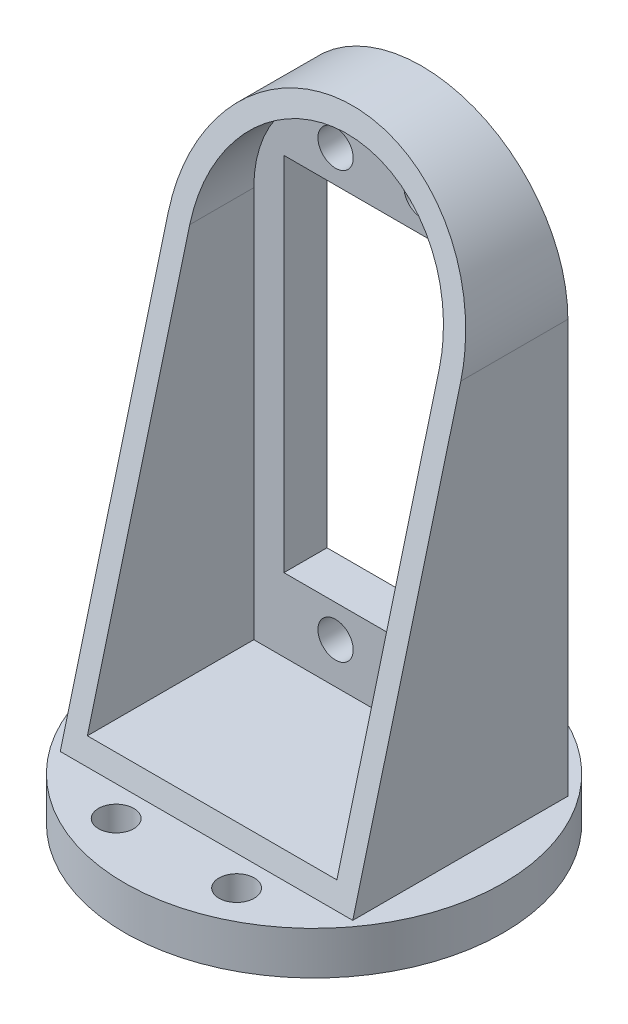
ISO-10303-21;
HEADER;
FILE_DESCRIPTION(('STEP AP214'),'2;1');
FILE_NAME('part.step','',(''),(''),'','','');
FILE_SCHEMA(('AUTOMOTIVE_DESIGN { 1 0 10303 214 1 1 1 1 }'));
ENDSEC;
DATA;
#1=APPLICATION_CONTEXT('core data for automotive mechanical design processes');
#2=APPLICATION_PROTOCOL_DEFINITION('international standard','automotive_design',2000,#1);
#3=PRODUCT_CONTEXT('',#1,'mechanical');
#4=PRODUCT('Part','Part','',(#3));
#5=PRODUCT_RELATED_PRODUCT_CATEGORY('part','',(#4));
#6=PRODUCT_DEFINITION_FORMATION('','',#4);
#7=PRODUCT_DEFINITION_CONTEXT('part definition',#1,'design');
#8=PRODUCT_DEFINITION('design','',#6,#7);
#9=PRODUCT_DEFINITION_SHAPE('','',#8);
#10=(LENGTH_UNIT() NAMED_UNIT(*) SI_UNIT(.MILLI.,.METRE.));
#11=(NAMED_UNIT(*) PLANE_ANGLE_UNIT() SI_UNIT($,.RADIAN.));
#12=(NAMED_UNIT(*) SI_UNIT($,.STERADIAN.) SOLID_ANGLE_UNIT());
#13=UNCERTAINTY_MEASURE_WITH_UNIT(LENGTH_MEASURE(1.E-05),#10,'distance_accuracy_value','');
#14=(GEOMETRIC_REPRESENTATION_CONTEXT(3) GLOBAL_UNCERTAINTY_ASSIGNED_CONTEXT((#13)) GLOBAL_UNIT_ASSIGNED_CONTEXT((#10,
#11,#12)) REPRESENTATION_CONTEXT('',''));
#15=CARTESIAN_POINT('',(0.,0.,0.));
#16=DIRECTION('',(0.,0.,1.));
#17=DIRECTION('',(1.,0.,0.));
#18=AXIS2_PLACEMENT_3D('',#15,#16,#17);
#19=CARTESIAN_POINT('',(17.,0.,5.));
#20=DIRECTION('',(1.,0.,0.));
#21=DIRECTION('',(0.,1.,0.));
#22=AXIS2_PLACEMENT_3D('',#19,#20,#21);
#23=PLANE('',#22);
#24=DIRECTION('',(0.,0.967459022681129,-0.253027744393526));
#25=VECTOR('',#24,1.);
#26=CARTESIAN_POINT('',(17.,-32.,25.));
#27=LINE('',#26,#25);
#28=CARTESIAN_POINT('',(17.,-32.,25.));
#29=VERTEX_POINT('',#28);
#30=CARTESIAN_POINT('',(17.,16.,12.4461538461538));
#31=VERTEX_POINT('',#30);
#32=EDGE_CURVE('E485',#29,#31,#27,.T.);
#33=ORIENTED_EDGE('',*,*,#32,.F.);
#34=DIRECTION('',(0.,0.,-1.));
#35=VECTOR('',#34,1.);
#36=CARTESIAN_POINT('',(17.,-32.,5.));
#37=LINE('',#36,#35);
#38=CARTESIAN_POINT('',(17.,-32.,0.));
#39=VERTEX_POINT('',#38);
#40=EDGE_CURVE('E177',#29,#39,#37,.T.);
#41=ORIENTED_EDGE('',*,*,#40,.T.);
#42=DIRECTION('',(0.,-1.,0.));
#43=VECTOR('',#42,1.);
#44=CARTESIAN_POINT('',(17.,0.,0.));
#45=LINE('',#44,#43);
#46=CARTESIAN_POINT('',(17.,16.,0.));
#47=VERTEX_POINT('',#46);
#48=EDGE_CURVE('E157',#47,#39,#45,.T.);
#49=ORIENTED_EDGE('',*,*,#48,.F.);
#50=DIRECTION('',(0.,0.,-1.));
#51=VECTOR('',#50,1.);
#52=CARTESIAN_POINT('',(17.,16.,5.));
#53=LINE('',#52,#51);
#54=EDGE_CURVE('E68',#31,#47,#53,.T.);
#55=ORIENTED_EDGE('',*,*,#54,.F.);
#56=EDGE_LOOP('',(#33,#41,#49,#55));
#57=FACE_BOUND('',#56,.T.);
#58=ADVANCED_FACE('F61',(#57),#23,.T.);
#59=CARTESIAN_POINT('',(0.,16.,5.));
#60=DIRECTION('',(0.,0.,-1.));
#61=DIRECTION('',(-1.,0.,0.));
#62=AXIS2_PLACEMENT_3D('',#59,#60,#61);
#63=CYLINDRICAL_SURFACE('',#62,17.);
#64=CARTESIAN_POINT('',(0.,16.,12.4461538461538));
#65=DIRECTION('',(0.,-0.253027744393526,-0.967459022681128));
#66=DIRECTION('',(0.,0.967459022681129,-0.253027744393526));
#67=AXIS2_PLACEMENT_3D('',#64,#65,#66);
#68=ELLIPSE('',#67,17.5718036644981,17.);
#69=CARTESIAN_POINT('',(-17.,16.,12.4461538461538));
#70=VERTEX_POINT('',#69);
#71=EDGE_CURVE('E186',#70,#31,#68,.T.);
#72=ORIENTED_EDGE('',*,*,#71,.T.);
#73=ORIENTED_EDGE('',*,*,#54,.T.);
#74=CARTESIAN_POINT('',(0.,16.,0.));
#75=DIRECTION('',(0.,0.,1.));
#76=DIRECTION('',(1.,0.,0.));
#77=AXIS2_PLACEMENT_3D('',#74,#75,#76);
#78=CIRCLE('',#77,17.);
#79=CARTESIAN_POINT('',(-17.,16.,0.));
#80=VERTEX_POINT('',#79);
#81=EDGE_CURVE('E172',#47,#80,#78,.T.);
#82=ORIENTED_EDGE('',*,*,#81,.T.);
#83=DIRECTION('',(0.,0.,-1.));
#84=VECTOR('',#83,1.);
#85=CARTESIAN_POINT('',(-17.,16.,5.));
#86=LINE('',#85,#84);
#87=EDGE_CURVE('E170',#70,#80,#86,.T.);
#88=ORIENTED_EDGE('',*,*,#87,.F.);
#89=EDGE_LOOP('',(#72,#73,#82,#88));
#90=FACE_BOUND('',#89,.T.);
#91=ADVANCED_FACE('F185',(#90),#63,.T.);
#92=CARTESIAN_POINT('',(-17.,0.,5.));
#93=DIRECTION('',(1.,0.,0.));
#94=DIRECTION('',(0.,1.,0.));
#95=AXIS2_PLACEMENT_3D('',#92,#93,#94);
#96=PLANE('',#95);
#97=DIRECTION('',(0.,0.,-1.));
#98=VECTOR('',#97,1.);
#99=CARTESIAN_POINT('',(-17.,-32.,5.));
#100=LINE('',#99,#98);
#101=CARTESIAN_POINT('',(-17.,-32.,25.));
#102=VERTEX_POINT('',#101);
#103=CARTESIAN_POINT('',(-17.,-32.,0.));
#104=VERTEX_POINT('',#103);
#105=EDGE_CURVE('E167',#102,#104,#100,.T.);
#106=ORIENTED_EDGE('',*,*,#105,.F.);
#107=DIRECTION('',(0.,0.967459022681129,-0.253027744393526));
#108=VECTOR('',#107,1.);
#109=CARTESIAN_POINT('',(-17.,-32.,25.));
#110=LINE('',#109,#108);
#111=EDGE_CURVE('E488',#102,#70,#110,.T.);
#112=ORIENTED_EDGE('',*,*,#111,.T.);
#113=ORIENTED_EDGE('',*,*,#87,.T.);
#114=DIRECTION('',(0.,-1.,0.));
#115=VECTOR('',#114,1.);
#116=CARTESIAN_POINT('',(-17.,0.,0.));
#117=LINE('',#116,#115);
#118=EDGE_CURVE('E155',#80,#104,#117,.T.);
#119=ORIENTED_EDGE('',*,*,#118,.T.);
#120=EDGE_LOOP('',(#106,#112,#113,#119));
#121=FACE_BOUND('',#120,.T.);
#122=ADVANCED_FACE('F165',(#121),#96,.F.);
#123=CARTESIAN_POINT('',(5.00000000000051,-24.75,5.));
#124=DIRECTION('',(0.,0.,-1.));
#125=DIRECTION('',(-1.,0.,0.));
#126=AXIS2_PLACEMENT_3D('',#123,#124,#125);
#127=CYLINDRICAL_SURFACE('',#126,2.05);
#128=CARTESIAN_POINT('',(5.00000000000051,-24.75,5.));
#129=DIRECTION('',(0.,0.,1.));
#130=DIRECTION('',(1.,0.,0.));
#131=AXIS2_PLACEMENT_3D('',#128,#129,#130);
#132=CIRCLE('',#131,2.05);
#133=CARTESIAN_POINT('',(7.05000000000051,-24.75,5.));
#134=VERTEX_POINT('',#133);
#135=EDGE_CURVE('E216',#134,#134,#132,.T.);
#136=ORIENTED_EDGE('',*,*,#135,.T.);
#137=EDGE_LOOP('',(#136));
#138=FACE_BOUND('',#137,.T.);
#139=CARTESIAN_POINT('',(5.00000000000051,-24.75,0.));
#140=DIRECTION('',(0.,0.,1.));
#141=DIRECTION('',(1.,0.,0.));
#142=AXIS2_PLACEMENT_3D('',#139,#140,#141);
#143=CIRCLE('',#142,2.05);
#144=CARTESIAN_POINT('',(7.05000000000051,-24.75,0.));
#145=VERTEX_POINT('',#144);
#146=EDGE_CURVE('E203',#145,#145,#143,.T.);
#147=ORIENTED_EDGE('',*,*,#146,.F.);
#148=EDGE_LOOP('',(#147));
#149=FACE_BOUND('',#148,.T.);
#150=ADVANCED_FACE('F252',(#138,#149),#127,.F.);
#151=CARTESIAN_POINT('',(-5.00000000000026,24.75,5.));
#152=DIRECTION('',(0.,0.,-1.));
#153=DIRECTION('',(-1.,0.,0.));
#154=AXIS2_PLACEMENT_3D('',#151,#152,#153);
#155=CYLINDRICAL_SURFACE('',#154,2.05000000000024);
#156=CARTESIAN_POINT('',(-5.00000000000026,24.75,5.));
#157=DIRECTION('',(0.,0.,1.));
#158=DIRECTION('',(1.,0.,0.));
#159=AXIS2_PLACEMENT_3D('',#156,#157,#158);
#160=CIRCLE('',#159,2.05000000000024);
#161=CARTESIAN_POINT('',(-2.95000000000002,24.75,5.));
#162=VERTEX_POINT('',#161);
#163=EDGE_CURVE('E211',#162,#162,#160,.T.);
#164=ORIENTED_EDGE('',*,*,#163,.T.);
#165=EDGE_LOOP('',(#164));
#166=FACE_BOUND('',#165,.T.);
#167=CARTESIAN_POINT('',(-5.00000000000026,24.75,0.));
#168=DIRECTION('',(0.,0.,1.));
#169=DIRECTION('',(1.,0.,0.));
#170=AXIS2_PLACEMENT_3D('',#167,#168,#169);
#171=CIRCLE('',#170,2.05000000000024);
#172=CARTESIAN_POINT('',(-2.95000000000002,24.75,0.));
#173=VERTEX_POINT('',#172);
#174=EDGE_CURVE('E200',#173,#173,#171,.T.);
#175=ORIENTED_EDGE('',*,*,#174,.F.);
#176=EDGE_LOOP('',(#175));
#177=FACE_BOUND('',#176,.T.);
#178=ADVANCED_FACE('F257',(#166,#177),#155,.F.);
#179=CARTESIAN_POINT('',(4.99999999999974,24.75,5.));
#180=DIRECTION('',(0.,0.,-1.));
#181=DIRECTION('',(-1.,0.,0.));
#182=AXIS2_PLACEMENT_3D('',#179,#180,#181);
#183=CYLINDRICAL_SURFACE('',#182,2.05000000000024);
#184=CARTESIAN_POINT('',(4.99999999999974,24.75,5.));
#185=DIRECTION('',(0.,0.,1.));
#186=DIRECTION('',(1.,0.,0.));
#187=AXIS2_PLACEMENT_3D('',#184,#185,#186);
#188=CIRCLE('',#187,2.05000000000024);
#189=CARTESIAN_POINT('',(7.04999999999999,24.75,5.));
#190=VERTEX_POINT('',#189);
#191=EDGE_CURVE('E207',#190,#190,#188,.T.);
#192=ORIENTED_EDGE('',*,*,#191,.T.);
#193=EDGE_LOOP('',(#192));
#194=FACE_BOUND('',#193,.T.);
#195=CARTESIAN_POINT('',(4.99999999999974,24.75,0.));
#196=DIRECTION('',(0.,0.,1.));
#197=DIRECTION('',(1.,0.,0.));
#198=AXIS2_PLACEMENT_3D('',#195,#196,#197);
#199=CIRCLE('',#198,2.05000000000024);
#200=CARTESIAN_POINT('',(7.04999999999999,24.75,0.));
#201=VERTEX_POINT('',#200);
#202=EDGE_CURVE('E161',#201,#201,#199,.T.);
#203=ORIENTED_EDGE('',*,*,#202,.F.);
#204=EDGE_LOOP('',(#203));
#205=FACE_BOUND('',#204,.T.);
#206=ADVANCED_FACE('F241',(#194,#205),#183,.F.);
#207=CARTESIAN_POINT('',(-4.99999999999949,-24.75,5.));
#208=DIRECTION('',(0.,0.,-1.));
#209=DIRECTION('',(-1.,0.,0.));
#210=AXIS2_PLACEMENT_3D('',#207,#208,#209);
#211=CYLINDRICAL_SURFACE('',#210,2.05);
#212=CARTESIAN_POINT('',(-4.99999999999949,-24.75,5.));
#213=DIRECTION('',(0.,0.,1.));
#214=DIRECTION('',(1.,0.,0.));
#215=AXIS2_PLACEMENT_3D('',#212,#213,#214);
#216=CIRCLE('',#215,2.05);
#217=CARTESIAN_POINT('',(-2.94999999999949,-24.75,5.));
#218=VERTEX_POINT('',#217);
#219=EDGE_CURVE('E180',#218,#218,#216,.T.);
#220=ORIENTED_EDGE('',*,*,#219,.T.);
#221=EDGE_LOOP('',(#220));
#222=FACE_BOUND('',#221,.T.);
#223=CARTESIAN_POINT('',(-4.99999999999949,-24.75,0.));
#224=DIRECTION('',(0.,0.,1.));
#225=DIRECTION('',(1.,0.,0.));
#226=AXIS2_PLACEMENT_3D('',#223,#224,#225);
#227=CIRCLE('',#226,2.05);
#228=CARTESIAN_POINT('',(-2.94999999999949,-24.75,0.));
#229=VERTEX_POINT('',#228);
#230=EDGE_CURVE('E205',#229,#229,#227,.T.);
#231=ORIENTED_EDGE('',*,*,#230,.F.);
#232=EDGE_LOOP('',(#231));
#233=FACE_BOUND('',#232,.T.);
#234=ADVANCED_FACE('F227',(#222,#233),#211,.F.);
#235=CARTESIAN_POINT('',(0.,0.,5.));
#236=DIRECTION('',(0.,0.,1.));
#237=DIRECTION('',(1.,0.,0.));
#238=AXIS2_PLACEMENT_3D('',#235,#236,#237);
#239=PLANE('',#238);
#240=CARTESIAN_POINT('',(0.,16.,5.));
#241=DIRECTION('',(0.,0.,1.));
#242=DIRECTION('',(1.,0.,0.));
#243=AXIS2_PLACEMENT_3D('',#240,#241,#242);
#244=CIRCLE('',#243,14.5);
#245=CARTESIAN_POINT('',(14.5,16.,5.));
#246=VERTEX_POINT('',#245);
#247=CARTESIAN_POINT('',(-14.5,16.,5.));
#248=VERTEX_POINT('',#247);
#249=EDGE_CURVE('E497',#246,#248,#244,.T.);
#250=ORIENTED_EDGE('',*,*,#249,.T.);
#251=DIRECTION('',(0.,-1.,0.));
#252=VECTOR('',#251,1.);
#253=CARTESIAN_POINT('',(-14.5,16.,5.));
#254=LINE('',#253,#252);
#255=CARTESIAN_POINT('',(-14.5,-29.5,5.));
#256=VERTEX_POINT('',#255);
#257=EDGE_CURVE('E499',#248,#256,#254,.T.);
#258=ORIENTED_EDGE('',*,*,#257,.T.);
#259=DIRECTION('',(1.,0.,0.));
#260=VECTOR('',#259,1.);
#261=CARTESIAN_POINT('',(-14.5,-29.5,5.));
#262=LINE('',#261,#260);
#263=CARTESIAN_POINT('',(14.5,-29.5,5.));
#264=VERTEX_POINT('',#263);
#265=EDGE_CURVE('E502',#256,#264,#262,.T.);
#266=ORIENTED_EDGE('',*,*,#265,.T.);
#267=DIRECTION('',(0.,1.,0.));
#268=VECTOR('',#267,1.);
#269=CARTESIAN_POINT('',(14.5,-29.5,5.));
#270=LINE('',#269,#268);
#271=EDGE_CURVE('E505',#264,#246,#270,.T.);
#272=ORIENTED_EDGE('',*,*,#271,.T.);
#273=EDGE_LOOP('',(#250,#258,#266,#272));
#274=FACE_BOUND('',#273,.T.);
#275=DIRECTION('',(1.,0.,0.));
#276=VECTOR('',#275,1.);
#277=CARTESIAN_POINT('',(-11.,21.,5.));
#278=LINE('',#277,#276);
#279=CARTESIAN_POINT('',(-11.,21.,5.));
#280=VERTEX_POINT('',#279);
#281=CARTESIAN_POINT('',(11.,21.,5.));
#282=VERTEX_POINT('',#281);
#283=EDGE_CURVE('E517',#280,#282,#278,.T.);
#284=ORIENTED_EDGE('',*,*,#283,.T.);
#285=DIRECTION('',(0.,1.,0.));
#286=VECTOR('',#285,1.);
#287=CARTESIAN_POINT('',(11.,-21.,5.));
#288=LINE('',#287,#286);
#289=CARTESIAN_POINT('',(11.,-21.,5.));
#290=VERTEX_POINT('',#289);
#291=EDGE_CURVE('E520',#290,#282,#288,.T.);
#292=ORIENTED_EDGE('',*,*,#291,.F.);
#293=DIRECTION('',(1.,0.,0.));
#294=VECTOR('',#293,1.);
#295=CARTESIAN_POINT('',(-11.,-21.,5.));
#296=LINE('',#295,#294);
#297=CARTESIAN_POINT('',(-11.,-21.,5.));
#298=VERTEX_POINT('',#297);
#299=EDGE_CURVE('E523',#298,#290,#296,.T.);
#300=ORIENTED_EDGE('',*,*,#299,.F.);
#301=DIRECTION('',(0.,1.,0.));
#302=VECTOR('',#301,1.);
#303=CARTESIAN_POINT('',(-11.,-21.,5.));
#304=LINE('',#303,#302);
#305=EDGE_CURVE('E526',#298,#280,#304,.T.);
#306=ORIENTED_EDGE('',*,*,#305,.T.);
#307=EDGE_LOOP('',(#284,#292,#300,#306));
#308=FACE_BOUND('',#307,.T.);
#309=ORIENTED_EDGE('',*,*,#191,.F.);
#310=EDGE_LOOP('',(#309));
#311=FACE_BOUND('',#310,.T.);
#312=ORIENTED_EDGE('',*,*,#163,.F.);
#313=EDGE_LOOP('',(#312));
#314=FACE_BOUND('',#313,.T.);
#315=ORIENTED_EDGE('',*,*,#135,.F.);
#316=EDGE_LOOP('',(#315));
#317=FACE_BOUND('',#316,.T.);
#318=ORIENTED_EDGE('',*,*,#219,.F.);
#319=EDGE_LOOP('',(#318));
#320=FACE_BOUND('',#319,.T.);
#321=ADVANCED_FACE('F230',(#274,#308,#311,#314,#317,#320),#239,.T.);
#322=CARTESIAN_POINT('',(0.,0.,0.));
#323=DIRECTION('',(0.,0.,1.));
#324=DIRECTION('',(1.,0.,0.));
#325=AXIS2_PLACEMENT_3D('',#322,#323,#324);
#326=PLANE('',#325);
#327=DIRECTION('',(0.,1.,0.));
#328=VECTOR('',#327,1.);
#329=CARTESIAN_POINT('',(11.,-21.,0.));
#330=LINE('',#329,#328);
#331=CARTESIAN_POINT('',(11.,-21.,0.));
#332=VERTEX_POINT('',#331);
#333=CARTESIAN_POINT('',(11.,21.,0.));
#334=VERTEX_POINT('',#333);
#335=EDGE_CURVE('E530',#332,#334,#330,.T.);
#336=ORIENTED_EDGE('',*,*,#335,.T.);
#337=DIRECTION('',(1.,0.,0.));
#338=VECTOR('',#337,1.);
#339=CARTESIAN_POINT('',(-11.,21.,0.));
#340=LINE('',#339,#338);
#341=CARTESIAN_POINT('',(-11.,21.,0.));
#342=VERTEX_POINT('',#341);
#343=EDGE_CURVE('E516',#342,#334,#340,.T.);
#344=ORIENTED_EDGE('',*,*,#343,.F.);
#345=DIRECTION('',(0.,1.,0.));
#346=VECTOR('',#345,1.);
#347=CARTESIAN_POINT('',(-11.,-21.,0.));
#348=LINE('',#347,#346);
#349=CARTESIAN_POINT('',(-11.,-21.,0.));
#350=VERTEX_POINT('',#349);
#351=EDGE_CURVE('E521',#350,#342,#348,.T.);
#352=ORIENTED_EDGE('',*,*,#351,.F.);
#353=DIRECTION('',(1.,0.,0.));
#354=VECTOR('',#353,1.);
#355=CARTESIAN_POINT('',(-11.,-21.,0.));
#356=LINE('',#355,#354);
#357=EDGE_CURVE('E533',#350,#332,#356,.T.);
#358=ORIENTED_EDGE('',*,*,#357,.T.);
#359=EDGE_LOOP('',(#336,#344,#352,#358));
#360=FACE_BOUND('',#359,.T.);
#361=ORIENTED_EDGE('',*,*,#48,.T.);
#362=DIRECTION('',(-1.,0.,0.));
#363=VECTOR('',#362,1.);
#364=CARTESIAN_POINT('',(0.,-32.,0.));
#365=LINE('',#364,#363);
#366=EDGE_CURVE('E150',#39,#104,#365,.T.);
#367=ORIENTED_EDGE('',*,*,#366,.T.);
#368=ORIENTED_EDGE('',*,*,#118,.F.);
#369=ORIENTED_EDGE('',*,*,#81,.F.);
#370=EDGE_LOOP('',(#361,#367,#368,#369));
#371=FACE_BOUND('',#370,.T.);
#372=ORIENTED_EDGE('',*,*,#202,.T.);
#373=EDGE_LOOP('',(#372));
#374=FACE_BOUND('',#373,.T.);
#375=ORIENTED_EDGE('',*,*,#174,.T.);
#376=EDGE_LOOP('',(#375));
#377=FACE_BOUND('',#376,.T.);
#378=ORIENTED_EDGE('',*,*,#146,.T.);
#379=EDGE_LOOP('',(#378));
#380=FACE_BOUND('',#379,.T.);
#381=ORIENTED_EDGE('',*,*,#230,.T.);
#382=EDGE_LOOP('',(#381));
#383=FACE_BOUND('',#382,.T.);
#384=ADVANCED_FACE('F152',(#360,#371,#374,#377,#380,#383),#326,.F.);
#385=CARTESIAN_POINT('',(-11.,21.,5.));
#386=DIRECTION('',(0.,1.,0.));
#387=DIRECTION('',(0.,0.,1.));
#388=AXIS2_PLACEMENT_3D('',#385,#386,#387);
#389=PLANE('',#388);
#390=ORIENTED_EDGE('',*,*,#343,.T.);
#391=DIRECTION('',(0.,0.,-1.));
#392=VECTOR('',#391,1.);
#393=CARTESIAN_POINT('',(11.,21.,5.));
#394=LINE('',#393,#392);
#395=EDGE_CURVE('E219',#282,#334,#394,.T.);
#396=ORIENTED_EDGE('',*,*,#395,.F.);
#397=ORIENTED_EDGE('',*,*,#283,.F.);
#398=DIRECTION('',(0.,0.,-1.));
#399=VECTOR('',#398,1.);
#400=CARTESIAN_POINT('',(-11.,21.,5.));
#401=LINE('',#400,#399);
#402=EDGE_CURVE('E191',#280,#342,#401,.T.);
#403=ORIENTED_EDGE('',*,*,#402,.T.);
#404=EDGE_LOOP('',(#390,#396,#397,#403));
#405=FACE_BOUND('',#404,.T.);
#406=ADVANCED_FACE('F238',(#405),#389,.F.);
#407=CARTESIAN_POINT('',(-11.,-21.,5.));
#408=DIRECTION('',(-1.,0.,0.));
#409=DIRECTION('',(0.,-1.,0.));
#410=AXIS2_PLACEMENT_3D('',#407,#408,#409);
#411=PLANE('',#410);
#412=ORIENTED_EDGE('',*,*,#351,.T.);
#413=ORIENTED_EDGE('',*,*,#402,.F.);
#414=ORIENTED_EDGE('',*,*,#305,.F.);
#415=DIRECTION('',(0.,0.,-1.));
#416=VECTOR('',#415,1.);
#417=CARTESIAN_POINT('',(-11.,-21.,5.));
#418=LINE('',#417,#416);
#419=EDGE_CURVE('E193',#298,#350,#418,.T.);
#420=ORIENTED_EDGE('',*,*,#419,.T.);
#421=EDGE_LOOP('',(#412,#413,#414,#420));
#422=FACE_BOUND('',#421,.T.);
#423=ADVANCED_FACE('F291',(#422),#411,.F.);
#424=CARTESIAN_POINT('',(-11.,-21.,5.));
#425=DIRECTION('',(0.,1.,0.));
#426=DIRECTION('',(0.,0.,1.));
#427=AXIS2_PLACEMENT_3D('',#424,#425,#426);
#428=PLANE('',#427);
#429=ORIENTED_EDGE('',*,*,#357,.F.);
#430=ORIENTED_EDGE('',*,*,#419,.F.);
#431=ORIENTED_EDGE('',*,*,#299,.T.);
#432=DIRECTION('',(0.,0.,-1.));
#433=VECTOR('',#432,1.);
#434=CARTESIAN_POINT('',(11.,-21.,5.));
#435=LINE('',#434,#433);
#436=EDGE_CURVE('E538',#290,#332,#435,.T.);
#437=ORIENTED_EDGE('',*,*,#436,.T.);
#438=EDGE_LOOP('',(#429,#430,#431,#437));
#439=FACE_BOUND('',#438,.T.);
#440=ADVANCED_FACE('F301',(#439),#428,.T.);
#441=CARTESIAN_POINT('',(11.,-21.,5.));
#442=DIRECTION('',(-1.,0.,0.));
#443=DIRECTION('',(0.,-1.,0.));
#444=AXIS2_PLACEMENT_3D('',#441,#442,#443);
#445=PLANE('',#444);
#446=ORIENTED_EDGE('',*,*,#335,.F.);
#447=ORIENTED_EDGE('',*,*,#436,.F.);
#448=ORIENTED_EDGE('',*,*,#291,.T.);
#449=ORIENTED_EDGE('',*,*,#395,.T.);
#450=EDGE_LOOP('',(#446,#447,#448,#449));
#451=FACE_BOUND('',#450,.T.);
#452=ADVANCED_FACE('F311',(#451),#445,.T.);
#453=CARTESIAN_POINT('',(0.,16.,25.));
#454=DIRECTION('',(0.,0.,-1.));
#455=DIRECTION('',(-1.,0.,0.));
#456=AXIS2_PLACEMENT_3D('',#453,#454,#455);
#457=CYLINDRICAL_SURFACE('',#456,14.5);
#458=CARTESIAN_POINT('',(0.,16.,12.4461538461538));
#459=DIRECTION('',(0.,-0.253027744393526,-0.967459022681128));
#460=DIRECTION('',(0.,0.967459022681129,-0.253027744393526));
#461=AXIS2_PLACEMENT_3D('',#458,#459,#460);
#462=ELLIPSE('',#461,14.9877148903072,14.5);
#463=CARTESIAN_POINT('',(-14.5,16.,12.4461538461538));
#464=VERTEX_POINT('',#463);
#465=CARTESIAN_POINT('',(14.5,16.,12.4461538461538));
#466=VERTEX_POINT('',#465);
#467=EDGE_CURVE('E74',#464,#466,#462,.T.);
#468=ORIENTED_EDGE('',*,*,#467,.F.);
#469=DIRECTION('',(0.,0.,-1.));
#470=VECTOR('',#469,1.);
#471=CARTESIAN_POINT('',(-14.5,16.,25.));
#472=LINE('',#471,#470);
#473=EDGE_CURVE('E81',#464,#248,#472,.T.);
#474=ORIENTED_EDGE('',*,*,#473,.T.);
#475=ORIENTED_EDGE('',*,*,#249,.F.);
#476=DIRECTION('',(0.,0.,-1.));
#477=VECTOR('',#476,1.);
#478=CARTESIAN_POINT('',(14.5,16.,25.));
#479=LINE('',#478,#477);
#480=EDGE_CURVE('E508',#466,#246,#479,.T.);
#481=ORIENTED_EDGE('',*,*,#480,.F.);
#482=EDGE_LOOP('',(#468,#474,#475,#481));
#483=FACE_BOUND('',#482,.T.);
#484=ADVANCED_FACE('F320',(#483),#457,.F.);
#485=CARTESIAN_POINT('',(-14.5,16.,25.));
#486=DIRECTION('',(1.,0.,0.));
#487=DIRECTION('',(0.,0.,-1.));
#488=AXIS2_PLACEMENT_3D('',#485,#486,#487);
#489=PLANE('',#488);
#490=DIRECTION('',(0.,0.967459022681129,-0.253027744393526));
#491=VECTOR('',#490,1.);
#492=CARTESIAN_POINT('',(-14.5,12.926894107222,13.2498892334958));
#493=LINE('',#492,#491);
#494=CARTESIAN_POINT('',(-14.5,-29.5,24.3461538461538));
#495=VERTEX_POINT('',#494);
#496=EDGE_CURVE('E493',#495,#464,#493,.T.);
#497=ORIENTED_EDGE('',*,*,#496,.F.);
#498=DIRECTION('',(0.,0.,-1.));
#499=VECTOR('',#498,1.);
#500=CARTESIAN_POINT('',(-14.5,-29.5,25.));
#501=LINE('',#500,#499);
#502=EDGE_CURVE('E512',#495,#256,#501,.T.);
#503=ORIENTED_EDGE('',*,*,#502,.T.);
#504=ORIENTED_EDGE('',*,*,#257,.F.);
#505=ORIENTED_EDGE('',*,*,#473,.F.);
#506=EDGE_LOOP('',(#497,#503,#504,#505));
#507=FACE_BOUND('',#506,.T.);
#508=ADVANCED_FACE('F344',(#507),#489,.T.);
#509=CARTESIAN_POINT('',(-14.5,-29.5,25.));
#510=DIRECTION('',(0.,1.,0.));
#511=DIRECTION('',(0.,0.,1.));
#512=AXIS2_PLACEMENT_3D('',#509,#510,#511);
#513=PLANE('',#512);
#514=DIRECTION('',(-1.,0.,0.));
#515=VECTOR('',#514,1.);
#516=CARTESIAN_POINT('',(-14.5,-29.5,24.3461538461538));
#517=LINE('',#516,#515);
#518=CARTESIAN_POINT('',(14.5,-29.5,24.3461538461538));
#519=VERTEX_POINT('',#518);
#520=EDGE_CURVE('E490',#519,#495,#517,.T.);
#521=ORIENTED_EDGE('',*,*,#520,.F.);
#522=DIRECTION('',(0.,0.,-1.));
#523=VECTOR('',#522,1.);
#524=CARTESIAN_POINT('',(14.5,-29.5,25.));
#525=LINE('',#524,#523);
#526=EDGE_CURVE('E510',#519,#264,#525,.T.);
#527=ORIENTED_EDGE('',*,*,#526,.T.);
#528=ORIENTED_EDGE('',*,*,#265,.F.);
#529=ORIENTED_EDGE('',*,*,#502,.F.);
#530=EDGE_LOOP('',(#521,#527,#528,#529));
#531=FACE_BOUND('',#530,.T.);
#532=ADVANCED_FACE('F353',(#531),#513,.T.);
#533=CARTESIAN_POINT('',(14.5,-29.5,25.));
#534=DIRECTION('',(-1.,0.,0.));
#535=DIRECTION('',(0.,-1.,0.));
#536=AXIS2_PLACEMENT_3D('',#533,#534,#535);
#537=PLANE('',#536);
#538=DIRECTION('',(0.,-0.967459022681129,0.253027744393526));
#539=VECTOR('',#538,1.);
#540=CARTESIAN_POINT('',(14.5,-29.6600575985822,24.3880150642446));
#541=LINE('',#540,#539);
#542=EDGE_CURVE('E12',#466,#519,#541,.T.);
#543=ORIENTED_EDGE('',*,*,#542,.F.);
#544=ORIENTED_EDGE('',*,*,#480,.T.);
#545=ORIENTED_EDGE('',*,*,#271,.F.);
#546=ORIENTED_EDGE('',*,*,#526,.F.);
#547=EDGE_LOOP('',(#543,#544,#545,#546));
#548=FACE_BOUND('',#547,.T.);
#549=ADVANCED_FACE('F363',(#548),#537,.T.);
#550=CARTESIAN_POINT('',(-17.,-32.,25.));
#551=DIRECTION('',(0.,-0.253027744393526,-0.967459022681128));
#552=DIRECTION('',(0.,0.967459022681129,-0.253027744393526));
#553=AXIS2_PLACEMENT_3D('',#550,#551,#552);
#554=PLANE('',#553);
#555=ORIENTED_EDGE('',*,*,#467,.T.);
#556=ORIENTED_EDGE('',*,*,#542,.T.);
#557=ORIENTED_EDGE('',*,*,#520,.T.);
#558=ORIENTED_EDGE('',*,*,#496,.T.);
#559=EDGE_LOOP('',(#555,#556,#557,#558));
#560=FACE_BOUND('',#559,.T.);
#561=ORIENTED_EDGE('',*,*,#71,.F.);
#562=ORIENTED_EDGE('',*,*,#111,.F.);
#563=DIRECTION('',(1.,0.,0.));
#564=VECTOR('',#563,1.);
#565=CARTESIAN_POINT('',(-17.,-32.,25.));
#566=LINE('',#565,#564);
#567=EDGE_CURVE('E176',#102,#29,#566,.T.);
#568=ORIENTED_EDGE('',*,*,#567,.T.);
#569=ORIENTED_EDGE('',*,*,#32,.T.);
#570=EDGE_LOOP('',(#561,#562,#568,#569));
#571=FACE_BOUND('',#570,.T.);
#572=ADVANCED_FACE('F372',(#560,#571),#554,.F.);
#573=CARTESIAN_POINT('',(0.,-37.,12.5));
#574=DIRECTION('',(0.,1.,0.));
#575=DIRECTION('',(-1.,0.,0.));
#576=AXIS2_PLACEMENT_3D('',#573,#574,#575);
#577=CYLINDRICAL_SURFACE('',#576,22.);
#578=CARTESIAN_POINT('',(0.,-37.,12.5));
#579=DIRECTION('',(0.,-1.,0.));
#580=DIRECTION('',(1.,0.,0.));
#581=AXIS2_PLACEMENT_3D('',#578,#579,#580);
#582=CIRCLE('',#581,22.);
#583=CARTESIAN_POINT('',(22.,-37.,12.5));
#584=VERTEX_POINT('',#583);
#585=EDGE_CURVE('E482',#584,#584,#582,.T.);
#586=ORIENTED_EDGE('',*,*,#585,.F.);
#587=EDGE_LOOP('',(#586));
#588=FACE_BOUND('',#587,.T.);
#589=CARTESIAN_POINT('',(0.,-32.,12.5));
#590=DIRECTION('',(0.,-1.,0.));
#591=DIRECTION('',(1.,0.,0.));
#592=AXIS2_PLACEMENT_3D('',#589,#590,#591);
#593=CIRCLE('',#592,22.);
#594=CARTESIAN_POINT('',(22.,-32.,12.5));
#595=VERTEX_POINT('',#594);
#596=EDGE_CURVE('E468',#595,#595,#593,.T.);
#597=ORIENTED_EDGE('',*,*,#596,.T.);
#598=EDGE_LOOP('',(#597));
#599=FACE_BOUND('',#598,.T.);
#600=ADVANCED_FACE('F397',(#588,#599),#577,.T.);
#601=CARTESIAN_POINT('',(0.,-37.,12.5));
#602=DIRECTION('',(0.,-1.,0.));
#603=DIRECTION('',(1.,0.,0.));
#604=AXIS2_PLACEMENT_3D('',#601,#602,#603);
#605=PLANE('',#604);
#606=CARTESIAN_POINT('',(0.,-37.,-5.));
#607=DIRECTION('',(0.,1.,0.));
#608=DIRECTION('',(-1.,0.,0.));
#609=AXIS2_PLACEMENT_3D('',#606,#607,#608);
#610=CIRCLE('',#609,2.05);
#611=CARTESIAN_POINT('',(-2.04999999999999,-37.,-5.));
#612=VERTEX_POINT('',#611);
#613=EDGE_CURVE('E462',#612,#612,#610,.T.);
#614=ORIENTED_EDGE('',*,*,#613,.T.);
#615=EDGE_LOOP('',(#614));
#616=FACE_BOUND('',#615,.T.);
#617=CARTESIAN_POINT('',(-6.99999999999999,-37.,28.5));
#618=DIRECTION('',(0.,1.,0.));
#619=DIRECTION('',(-1.,0.,0.));
#620=AXIS2_PLACEMENT_3D('',#617,#618,#619);
#621=CIRCLE('',#620,2.05);
#622=CARTESIAN_POINT('',(-9.04999999999999,-37.,28.5));
#623=VERTEX_POINT('',#622);
#624=EDGE_CURVE('E466',#623,#623,#621,.T.);
#625=ORIENTED_EDGE('',*,*,#624,.T.);
#626=EDGE_LOOP('',(#625));
#627=FACE_BOUND('',#626,.T.);
#628=CARTESIAN_POINT('',(7.00000000000001,-37.,28.5));
#629=DIRECTION('',(0.,1.,0.));
#630=DIRECTION('',(-1.,0.,0.));
#631=AXIS2_PLACEMENT_3D('',#628,#629,#630);
#632=CIRCLE('',#631,2.05);
#633=CARTESIAN_POINT('',(4.95000000000001,-37.,28.5));
#634=VERTEX_POINT('',#633);
#635=EDGE_CURVE('E476',#634,#634,#632,.T.);
#636=ORIENTED_EDGE('',*,*,#635,.T.);
#637=EDGE_LOOP('',(#636));
#638=FACE_BOUND('',#637,.T.);
#639=ORIENTED_EDGE('',*,*,#585,.T.);
#640=EDGE_LOOP('',(#639));
#641=FACE_BOUND('',#640,.T.);
#642=ADVANCED_FACE('F406',(#616,#627,#638,#641),#605,.T.);
#643=CARTESIAN_POINT('',(0.,-32.,12.5));
#644=DIRECTION('',(0.,-1.,0.));
#645=DIRECTION('',(1.,0.,0.));
#646=AXIS2_PLACEMENT_3D('',#643,#644,#645);
#647=PLANE('',#646);
#648=CARTESIAN_POINT('',(0.,-32.,-5.));
#649=DIRECTION('',(0.,1.,0.));
#650=DIRECTION('',(-1.,0.,0.));
#651=AXIS2_PLACEMENT_3D('',#648,#649,#650);
#652=CIRCLE('',#651,2.05);
#653=CARTESIAN_POINT('',(-2.04999999999999,-32.,-5.));
#654=VERTEX_POINT('',#653);
#655=EDGE_CURVE('E465',#654,#654,#652,.T.);
#656=ORIENTED_EDGE('',*,*,#655,.F.);
#657=EDGE_LOOP('',(#656));
#658=FACE_BOUND('',#657,.T.);
#659=CARTESIAN_POINT('',(-6.99999999999999,-32.,28.5));
#660=DIRECTION('',(0.,1.,0.));
#661=DIRECTION('',(-1.,0.,0.));
#662=AXIS2_PLACEMENT_3D('',#659,#660,#661);
#663=CIRCLE('',#662,2.05);
#664=CARTESIAN_POINT('',(-9.04999999999999,-32.,28.5));
#665=VERTEX_POINT('',#664);
#666=EDGE_CURVE('E471',#665,#665,#663,.T.);
#667=ORIENTED_EDGE('',*,*,#666,.F.);
#668=EDGE_LOOP('',(#667));
#669=FACE_BOUND('',#668,.T.);
#670=CARTESIAN_POINT('',(7.00000000000001,-32.,28.5));
#671=DIRECTION('',(0.,1.,0.));
#672=DIRECTION('',(-1.,0.,0.));
#673=AXIS2_PLACEMENT_3D('',#670,#671,#672);
#674=CIRCLE('',#673,2.05);
#675=CARTESIAN_POINT('',(4.95000000000001,-32.,28.5));
#676=VERTEX_POINT('',#675);
#677=EDGE_CURVE('E479',#676,#676,#674,.T.);
#678=ORIENTED_EDGE('',*,*,#677,.F.);
#679=EDGE_LOOP('',(#678));
#680=FACE_BOUND('',#679,.T.);
#681=ORIENTED_EDGE('',*,*,#366,.F.);
#682=ORIENTED_EDGE('',*,*,#40,.F.);
#683=ORIENTED_EDGE('',*,*,#567,.F.);
#684=ORIENTED_EDGE('',*,*,#105,.T.);
#685=EDGE_LOOP('',(#681,#682,#683,#684));
#686=FACE_BOUND('',#685,.T.);
#687=ORIENTED_EDGE('',*,*,#596,.F.);
#688=EDGE_LOOP('',(#687));
#689=FACE_BOUND('',#688,.T.);
#690=ADVANCED_FACE('F174',(#658,#669,#680,#686,#689),#647,.F.);
#691=CARTESIAN_POINT('',(7.00000000000001,-37.,28.5));
#692=DIRECTION('',(0.,1.,0.));
#693=DIRECTION('',(-1.,0.,0.));
#694=AXIS2_PLACEMENT_3D('',#691,#692,#693);
#695=CYLINDRICAL_SURFACE('',#694,2.05);
#696=ORIENTED_EDGE('',*,*,#635,.F.);
#697=EDGE_LOOP('',(#696));
#698=FACE_BOUND('',#697,.T.);
#699=ORIENTED_EDGE('',*,*,#677,.T.);
#700=EDGE_LOOP('',(#699));
#701=FACE_BOUND('',#700,.T.);
#702=ADVANCED_FACE('F425',(#698,#701),#695,.F.);
#703=CARTESIAN_POINT('',(-6.99999999999999,-37.,28.5));
#704=DIRECTION('',(0.,1.,0.));
#705=DIRECTION('',(-1.,0.,0.));
#706=AXIS2_PLACEMENT_3D('',#703,#704,#705);
#707=CYLINDRICAL_SURFACE('',#706,2.05);
#708=ORIENTED_EDGE('',*,*,#624,.F.);
#709=EDGE_LOOP('',(#708));
#710=FACE_BOUND('',#709,.T.);
#711=ORIENTED_EDGE('',*,*,#666,.T.);
#712=EDGE_LOOP('',(#711));
#713=FACE_BOUND('',#712,.T.);
#714=ADVANCED_FACE('F435',(#710,#713),#707,.F.);
#715=CARTESIAN_POINT('',(0.,-37.,-5.));
#716=DIRECTION('',(0.,1.,0.));
#717=DIRECTION('',(-1.,0.,0.));
#718=AXIS2_PLACEMENT_3D('',#715,#716,#717);
#719=CYLINDRICAL_SURFACE('',#718,2.05);
#720=ORIENTED_EDGE('',*,*,#613,.F.);
#721=EDGE_LOOP('',(#720));
#722=FACE_BOUND('',#721,.T.);
#723=ORIENTED_EDGE('',*,*,#655,.T.);
#724=EDGE_LOOP('',(#723));
#725=FACE_BOUND('',#724,.T.);
#726=ADVANCED_FACE('F445',(#722,#725),#719,.F.);
#727=CLOSED_SHELL('',(#58,#91,#122,#150,#178,#206,#234,#321,#384,#406,#423,#440,#452,#484,#508,
#532,#549,#572,#600,#642,#690,#702,#714,#726));
#728=MANIFOLD_SOLID_BREP('B2',#727);
#729=ADVANCED_BREP_SHAPE_REPRESENTATION('',(#18,#728),#14);
#730=SHAPE_DEFINITION_REPRESENTATION(#9,#729);
ENDSEC;
END-ISO-10303-21;
